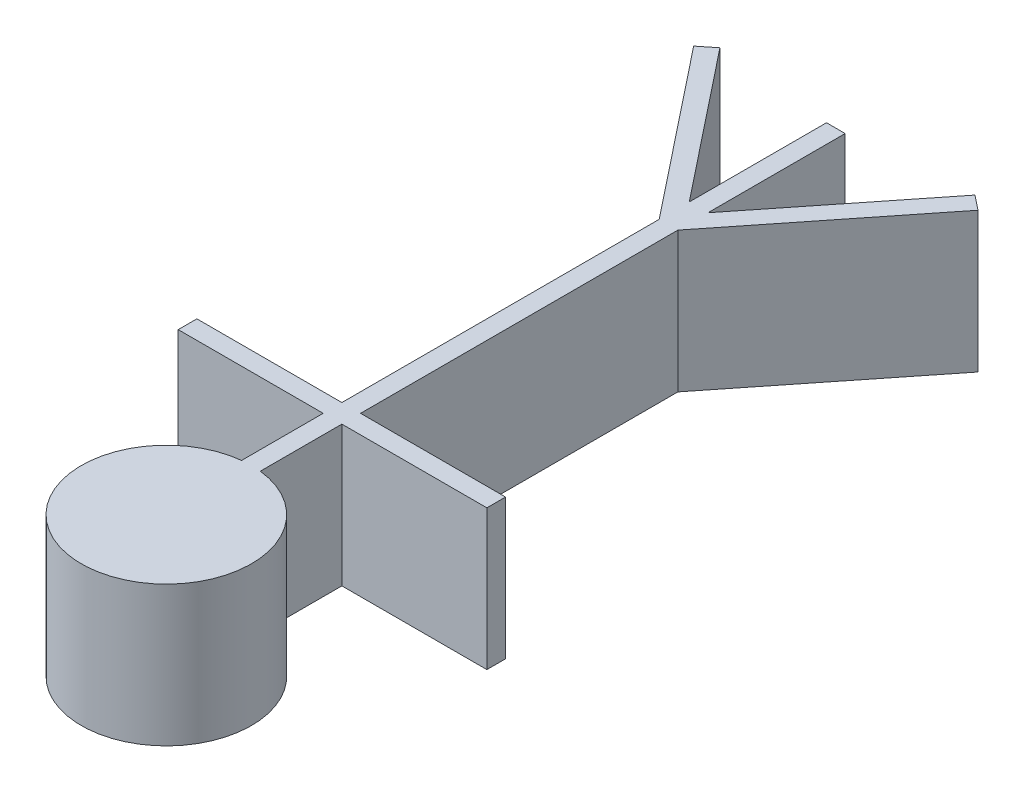
ISO-10303-21;
HEADER;
FILE_DESCRIPTION(('STEP AP214'),'2;1');
FILE_NAME('part.step','',(''),(''),'','','');
FILE_SCHEMA(('AUTOMOTIVE_DESIGN { 1 0 10303 214 1 1 1 1 }'));
ENDSEC;
DATA;
#1=APPLICATION_CONTEXT('core data for automotive mechanical design processes');
#2=APPLICATION_PROTOCOL_DEFINITION('international standard','automotive_design',2000,#1);
#3=PRODUCT_CONTEXT('',#1,'mechanical');
#4=PRODUCT('Part','Part','',(#3));
#5=PRODUCT_RELATED_PRODUCT_CATEGORY('part','',(#4));
#6=PRODUCT_DEFINITION_FORMATION('','',#4);
#7=PRODUCT_DEFINITION_CONTEXT('part definition',#1,'design');
#8=PRODUCT_DEFINITION('design','',#6,#7);
#9=PRODUCT_DEFINITION_SHAPE('','',#8);
#10=(LENGTH_UNIT() NAMED_UNIT(*) SI_UNIT(.MILLI.,.METRE.));
#11=(NAMED_UNIT(*) PLANE_ANGLE_UNIT() SI_UNIT($,.RADIAN.));
#12=(NAMED_UNIT(*) SI_UNIT($,.STERADIAN.) SOLID_ANGLE_UNIT());
#13=UNCERTAINTY_MEASURE_WITH_UNIT(LENGTH_MEASURE(1.E-05),#10,'distance_accuracy_value','');
#14=(GEOMETRIC_REPRESENTATION_CONTEXT(3) GLOBAL_UNCERTAINTY_ASSIGNED_CONTEXT((#13)) GLOBAL_UNIT_ASSIGNED_CONTEXT((#10,
#11,#12)) REPRESENTATION_CONTEXT('',''));
#15=CARTESIAN_POINT('',(0.,0.,0.));
#16=DIRECTION('',(0.,0.,1.));
#17=DIRECTION('',(1.,0.,0.));
#18=AXIS2_PLACEMENT_3D('',#15,#16,#17);
#19=CARTESIAN_POINT('',(-2.,30.,35.8119536050664));
#20=DIRECTION('',(1.,0.,0.));
#21=DIRECTION('',(0.,0.,-1.));
#22=AXIS2_PLACEMENT_3D('',#19,#20,#21);
#23=PLANE('',#22);
#24=DIRECTION('',(0.,0.,1.));
#25=VECTOR('',#24,1.);
#26=CARTESIAN_POINT('',(-2.,0.,35.8119536050664));
#27=LINE('',#26,#25);
#28=CARTESIAN_POINT('',(-2.,0.,35.8119536050664));
#29=VERTEX_POINT('',#28);
#30=CARTESIAN_POINT('',(-2.,0.,103.749471884295));
#31=VERTEX_POINT('',#30);
#32=EDGE_CURVE('E201',#29,#31,#27,.T.);
#33=ORIENTED_EDGE('',*,*,#32,.T.);
#34=DIRECTION('',(0.,-1.,0.));
#35=VECTOR('',#34,1.);
#36=CARTESIAN_POINT('',(-2.,30.,103.749471884295));
#37=LINE('',#36,#35);
#38=CARTESIAN_POINT('',(-2.,30.,103.749471884295));
#39=VERTEX_POINT('',#38);
#40=EDGE_CURVE('E11',#39,#31,#37,.T.);
#41=ORIENTED_EDGE('',*,*,#40,.F.);
#42=DIRECTION('',(0.,0.,1.));
#43=VECTOR('',#42,1.);
#44=CARTESIAN_POINT('',(-2.,30.,35.8119536050664));
#45=LINE('',#44,#43);
#46=CARTESIAN_POINT('',(-2.,30.,35.8119536050664));
#47=VERTEX_POINT('',#46);
#48=EDGE_CURVE('E239',#47,#39,#45,.T.);
#49=ORIENTED_EDGE('',*,*,#48,.F.);
#50=DIRECTION('',(0.,-1.,0.));
#51=VECTOR('',#50,1.);
#52=CARTESIAN_POINT('',(-2.,30.,35.8119536050664));
#53=LINE('',#52,#51);
#54=EDGE_CURVE('E197',#47,#29,#53,.T.);
#55=ORIENTED_EDGE('',*,*,#54,.T.);
#56=EDGE_LOOP('',(#33,#41,#49,#55));
#57=FACE_BOUND('',#56,.T.);
#58=ADVANCED_FACE('F33',(#57),#23,.F.);
#59=CARTESIAN_POINT('',(-33.0386105354812,30.,103.749471884295));
#60=DIRECTION('',(0.,0.,1.));
#61=DIRECTION('',(1.,0.,0.));
#62=AXIS2_PLACEMENT_3D('',#59,#60,#61);
#63=PLANE('',#62);
#64=DIRECTION('',(-1.,0.,0.));
#65=VECTOR('',#64,1.);
#66=CARTESIAN_POINT('',(-33.0386105354812,0.,103.749471884295));
#67=LINE('',#66,#65);
#68=CARTESIAN_POINT('',(-33.0386105354812,0.,103.749471884295));
#69=VERTEX_POINT('',#68);
#70=EDGE_CURVE('E204',#31,#69,#67,.T.);
#71=ORIENTED_EDGE('',*,*,#70,.T.);
#72=DIRECTION('',(0.,-1.,0.));
#73=VECTOR('',#72,1.);
#74=CARTESIAN_POINT('',(-33.0386105354812,30.,103.749471884295));
#75=LINE('',#74,#73);
#76=CARTESIAN_POINT('',(-33.0386105354812,30.,103.749471884295));
#77=VERTEX_POINT('',#76);
#78=EDGE_CURVE('E41',#77,#69,#75,.T.);
#79=ORIENTED_EDGE('',*,*,#78,.F.);
#80=DIRECTION('',(-1.,0.,0.));
#81=VECTOR('',#80,1.);
#82=CARTESIAN_POINT('',(-33.0386105354812,30.,103.749471884295));
#83=LINE('',#82,#81);
#84=EDGE_CURVE('E128',#39,#77,#83,.T.);
#85=ORIENTED_EDGE('',*,*,#84,.F.);
#86=ORIENTED_EDGE('',*,*,#40,.T.);
#87=EDGE_LOOP('',(#71,#79,#85,#86));
#88=FACE_BOUND('',#87,.T.);
#89=ADVANCED_FACE('F357',(#88),#63,.F.);
#90=CARTESIAN_POINT('',(-33.0386105354812,30.,107.749471884295));
#91=DIRECTION('',(1.,0.,0.));
#92=DIRECTION('',(0.,0.,-1.));
#93=AXIS2_PLACEMENT_3D('',#90,#91,#92);
#94=PLANE('',#93);
#95=DIRECTION('',(0.,0.,1.));
#96=VECTOR('',#95,1.);
#97=CARTESIAN_POINT('',(-33.0386105354812,0.,107.749471884295));
#98=LINE('',#97,#96);
#99=CARTESIAN_POINT('',(-33.0386105354812,0.,107.749471884295));
#100=VERTEX_POINT('',#99);
#101=EDGE_CURVE('E206',#69,#100,#98,.T.);
#102=ORIENTED_EDGE('',*,*,#101,.T.);
#103=DIRECTION('',(0.,-1.,0.));
#104=VECTOR('',#103,1.);
#105=CARTESIAN_POINT('',(-33.0386105354812,30.,107.749471884295));
#106=LINE('',#105,#104);
#107=CARTESIAN_POINT('',(-33.0386105354812,30.,107.749471884295));
#108=VERTEX_POINT('',#107);
#109=EDGE_CURVE('E282',#108,#100,#106,.T.);
#110=ORIENTED_EDGE('',*,*,#109,.F.);
#111=DIRECTION('',(0.,0.,1.));
#112=VECTOR('',#111,1.);
#113=CARTESIAN_POINT('',(-33.0386105354812,30.,107.749471884295));
#114=LINE('',#113,#112);
#115=EDGE_CURVE('E290',#77,#108,#114,.T.);
#116=ORIENTED_EDGE('',*,*,#115,.F.);
#117=ORIENTED_EDGE('',*,*,#78,.T.);
#118=EDGE_LOOP('',(#102,#110,#116,#117));
#119=FACE_BOUND('',#118,.T.);
#120=ADVANCED_FACE('F288',(#119),#94,.F.);
#121=CARTESIAN_POINT('',(-33.0386105354812,30.,107.749471884295));
#122=DIRECTION('',(0.,0.,-1.));
#123=DIRECTION('',(-1.,0.,0.));
#124=AXIS2_PLACEMENT_3D('',#121,#122,#123);
#125=PLANE('',#124);
#126=DIRECTION('',(1.,0.,0.));
#127=VECTOR('',#126,1.);
#128=CARTESIAN_POINT('',(-33.0386105354812,0.,107.749471884295));
#129=LINE('',#128,#127);
#130=CARTESIAN_POINT('',(-2.,0.,107.749471884295));
#131=VERTEX_POINT('',#130);
#132=EDGE_CURVE('E208',#100,#131,#129,.T.);
#133=ORIENTED_EDGE('',*,*,#132,.T.);
#134=DIRECTION('',(0.,-1.,0.));
#135=VECTOR('',#134,1.);
#136=CARTESIAN_POINT('',(-2.,30.,107.749471884295));
#137=LINE('',#136,#135);
#138=CARTESIAN_POINT('',(-2.,30.,107.749471884295));
#139=VERTEX_POINT('',#138);
#140=EDGE_CURVE('E279',#139,#131,#137,.T.);
#141=ORIENTED_EDGE('',*,*,#140,.F.);
#142=DIRECTION('',(1.,0.,0.));
#143=VECTOR('',#142,1.);
#144=CARTESIAN_POINT('',(-33.0386105354812,30.,107.749471884295));
#145=LINE('',#144,#143);
#146=EDGE_CURVE('E308',#108,#139,#145,.T.);
#147=ORIENTED_EDGE('',*,*,#146,.F.);
#148=ORIENTED_EDGE('',*,*,#109,.T.);
#149=EDGE_LOOP('',(#133,#141,#147,#148));
#150=FACE_BOUND('',#149,.T.);
#151=ADVANCED_FACE('F299',(#150),#125,.F.);
#152=CARTESIAN_POINT('',(-2.,30.,107.749471884295));
#153=DIRECTION('',(1.,0.,0.));
#154=DIRECTION('',(0.,0.,-1.));
#155=AXIS2_PLACEMENT_3D('',#152,#153,#154);
#156=PLANE('',#155);
#157=DIRECTION('',(0.,0.,1.));
#158=VECTOR('',#157,1.);
#159=CARTESIAN_POINT('',(-2.,0.,107.749471884295));
#160=LINE('',#159,#158);
#161=CARTESIAN_POINT('',(-2.,0.,125.214231970581));
#162=VERTEX_POINT('',#161);
#163=EDGE_CURVE('E210',#131,#162,#160,.T.);
#164=ORIENTED_EDGE('',*,*,#163,.T.);
#165=DIRECTION('',(0.,-1.,0.));
#166=VECTOR('',#165,1.);
#167=CARTESIAN_POINT('',(-2.,30.,125.214231970581));
#168=LINE('',#167,#166);
#169=CARTESIAN_POINT('',(-2.,30.,125.214231970581));
#170=VERTEX_POINT('',#169);
#171=EDGE_CURVE('E276',#170,#162,#168,.T.);
#172=ORIENTED_EDGE('',*,*,#171,.F.);
#173=DIRECTION('',(0.,0.,1.));
#174=VECTOR('',#173,1.);
#175=CARTESIAN_POINT('',(-2.,30.,107.749471884295));
#176=LINE('',#175,#174);
#177=EDGE_CURVE('E305',#139,#170,#176,.T.);
#178=ORIENTED_EDGE('',*,*,#177,.F.);
#179=ORIENTED_EDGE('',*,*,#140,.T.);
#180=EDGE_LOOP('',(#164,#172,#178,#179));
#181=FACE_BOUND('',#180,.T.);
#182=ADVANCED_FACE('F303',(#181),#156,.F.);
#183=CARTESIAN_POINT('',(0.,30.,143.326550630983));
#184=DIRECTION('',(0.,-1.,0.));
#185=DIRECTION('',(0.,0.,-1.));
#186=AXIS2_PLACEMENT_3D('',#183,#184,#185);
#187=CYLINDRICAL_SURFACE('',#186,18.2224061873281);
#188=CARTESIAN_POINT('',(0.,0.,143.326550630983));
#189=DIRECTION('',(0.,1.,0.));
#190=DIRECTION('',(0.,0.,1.));
#191=AXIS2_PLACEMENT_3D('',#188,#189,#190);
#192=CIRCLE('',#191,18.2224061873281);
#193=CARTESIAN_POINT('',(1.99999999999999,0.,125.214231970581));
#194=VERTEX_POINT('',#193);
#195=EDGE_CURVE('E212',#162,#194,#192,.T.);
#196=ORIENTED_EDGE('',*,*,#195,.T.);
#197=DIRECTION('',(0.,-1.,0.));
#198=VECTOR('',#197,1.);
#199=CARTESIAN_POINT('',(1.99999999999999,30.,125.214231970581));
#200=LINE('',#199,#198);
#201=CARTESIAN_POINT('',(1.99999999999999,30.,125.214231970581));
#202=VERTEX_POINT('',#201);
#203=EDGE_CURVE('E273',#202,#194,#200,.T.);
#204=ORIENTED_EDGE('',*,*,#203,.F.);
#205=CARTESIAN_POINT('',(0.,30.,143.326550630983));
#206=DIRECTION('',(0.,1.,0.));
#207=DIRECTION('',(0.,0.,1.));
#208=AXIS2_PLACEMENT_3D('',#205,#206,#207);
#209=CIRCLE('',#208,18.2224061873281);
#210=EDGE_CURVE('E307',#170,#202,#209,.T.);
#211=ORIENTED_EDGE('',*,*,#210,.F.);
#212=ORIENTED_EDGE('',*,*,#171,.T.);
#213=EDGE_LOOP('',(#196,#204,#211,#212));
#214=FACE_BOUND('',#213,.T.);
#215=ADVANCED_FACE('F370',(#214),#187,.T.);
#216=CARTESIAN_POINT('',(2.,30.,107.749471884295));
#217=DIRECTION('',(-1.,0.,0.));
#218=DIRECTION('',(0.,0.,1.));
#219=AXIS2_PLACEMENT_3D('',#216,#217,#218);
#220=PLANE('',#219);
#221=DIRECTION('',(0.,0.,-1.));
#222=VECTOR('',#221,1.);
#223=CARTESIAN_POINT('',(2.,0.,107.749471884295));
#224=LINE('',#223,#222);
#225=CARTESIAN_POINT('',(2.,0.,107.749471884295));
#226=VERTEX_POINT('',#225);
#227=EDGE_CURVE('E214',#194,#226,#224,.T.);
#228=ORIENTED_EDGE('',*,*,#227,.T.);
#229=DIRECTION('',(0.,-1.,0.));
#230=VECTOR('',#229,1.);
#231=CARTESIAN_POINT('',(2.,30.,107.749471884295));
#232=LINE('',#231,#230);
#233=CARTESIAN_POINT('',(2.,30.,107.749471884295));
#234=VERTEX_POINT('',#233);
#235=EDGE_CURVE('E270',#234,#226,#232,.T.);
#236=ORIENTED_EDGE('',*,*,#235,.F.);
#237=DIRECTION('',(0.,0.,-1.));
#238=VECTOR('',#237,1.);
#239=CARTESIAN_POINT('',(2.,30.,107.749471884295));
#240=LINE('',#239,#238);
#241=EDGE_CURVE('E310',#202,#234,#240,.T.);
#242=ORIENTED_EDGE('',*,*,#241,.F.);
#243=ORIENTED_EDGE('',*,*,#203,.T.);
#244=EDGE_LOOP('',(#228,#236,#242,#243));
#245=FACE_BOUND('',#244,.T.);
#246=ADVANCED_FACE('F373',(#245),#220,.F.);
#247=CARTESIAN_POINT('',(2.,30.,107.749471884295));
#248=DIRECTION('',(0.,0.,-1.));
#249=DIRECTION('',(-1.,0.,0.));
#250=AXIS2_PLACEMENT_3D('',#247,#248,#249);
#251=PLANE('',#250);
#252=DIRECTION('',(1.,0.,0.));
#253=VECTOR('',#252,1.);
#254=CARTESIAN_POINT('',(2.,0.,107.749471884295));
#255=LINE('',#254,#253);
#256=CARTESIAN_POINT('',(33.0386105354812,0.,107.749471884295));
#257=VERTEX_POINT('',#256);
#258=EDGE_CURVE('E216',#226,#257,#255,.T.);
#259=ORIENTED_EDGE('',*,*,#258,.T.);
#260=DIRECTION('',(0.,-1.,0.));
#261=VECTOR('',#260,1.);
#262=CARTESIAN_POINT('',(33.0386105354812,30.,107.749471884295));
#263=LINE('',#262,#261);
#264=CARTESIAN_POINT('',(33.0386105354812,30.,107.749471884295));
#265=VERTEX_POINT('',#264);
#266=EDGE_CURVE('E267',#265,#257,#263,.T.);
#267=ORIENTED_EDGE('',*,*,#266,.F.);
#268=DIRECTION('',(1.,0.,0.));
#269=VECTOR('',#268,1.);
#270=CARTESIAN_POINT('',(2.,30.,107.749471884295));
#271=LINE('',#270,#269);
#272=EDGE_CURVE('E316',#234,#265,#271,.T.);
#273=ORIENTED_EDGE('',*,*,#272,.F.);
#274=ORIENTED_EDGE('',*,*,#235,.T.);
#275=EDGE_LOOP('',(#259,#267,#273,#274));
#276=FACE_BOUND('',#275,.T.);
#277=ADVANCED_FACE('F377',(#276),#251,.F.);
#278=CARTESIAN_POINT('',(33.0386105354812,30.,107.749471884295));
#279=DIRECTION('',(-1.,0.,0.));
#280=DIRECTION('',(0.,0.,1.));
#281=AXIS2_PLACEMENT_3D('',#278,#279,#280);
#282=PLANE('',#281);
#283=DIRECTION('',(0.,0.,-1.));
#284=VECTOR('',#283,1.);
#285=CARTESIAN_POINT('',(33.0386105354812,0.,107.749471884295));
#286=LINE('',#285,#284);
#287=CARTESIAN_POINT('',(33.0386105354812,0.,103.749471884295));
#288=VERTEX_POINT('',#287);
#289=EDGE_CURVE('E218',#257,#288,#286,.T.);
#290=ORIENTED_EDGE('',*,*,#289,.T.);
#291=DIRECTION('',(0.,-1.,0.));
#292=VECTOR('',#291,1.);
#293=CARTESIAN_POINT('',(33.0386105354812,30.,103.749471884295));
#294=LINE('',#293,#292);
#295=CARTESIAN_POINT('',(33.0386105354812,30.,103.749471884295));
#296=VERTEX_POINT('',#295);
#297=EDGE_CURVE('E264',#296,#288,#294,.T.);
#298=ORIENTED_EDGE('',*,*,#297,.F.);
#299=DIRECTION('',(0.,0.,-1.));
#300=VECTOR('',#299,1.);
#301=CARTESIAN_POINT('',(33.0386105354812,30.,107.749471884295));
#302=LINE('',#301,#300);
#303=EDGE_CURVE('E318',#265,#296,#302,.T.);
#304=ORIENTED_EDGE('',*,*,#303,.F.);
#305=ORIENTED_EDGE('',*,*,#266,.T.);
#306=EDGE_LOOP('',(#290,#298,#304,#305));
#307=FACE_BOUND('',#306,.T.);
#308=ADVANCED_FACE('F381',(#307),#282,.F.);
#309=CARTESIAN_POINT('',(2.,30.,103.749471884295));
#310=DIRECTION('',(0.,0.,1.));
#311=DIRECTION('',(1.,0.,0.));
#312=AXIS2_PLACEMENT_3D('',#309,#310,#311);
#313=PLANE('',#312);
#314=DIRECTION('',(-1.,0.,0.));
#315=VECTOR('',#314,1.);
#316=CARTESIAN_POINT('',(2.,0.,103.749471884295));
#317=LINE('',#316,#315);
#318=CARTESIAN_POINT('',(2.,0.,103.749471884295));
#319=VERTEX_POINT('',#318);
#320=EDGE_CURVE('E220',#288,#319,#317,.T.);
#321=ORIENTED_EDGE('',*,*,#320,.T.);
#322=DIRECTION('',(0.,-1.,0.));
#323=VECTOR('',#322,1.);
#324=CARTESIAN_POINT('',(2.,30.,103.749471884295));
#325=LINE('',#324,#323);
#326=CARTESIAN_POINT('',(2.,30.,103.749471884295));
#327=VERTEX_POINT('',#326);
#328=EDGE_CURVE('E261',#327,#319,#325,.T.);
#329=ORIENTED_EDGE('',*,*,#328,.F.);
#330=DIRECTION('',(-1.,0.,0.));
#331=VECTOR('',#330,1.);
#332=CARTESIAN_POINT('',(2.,30.,103.749471884295));
#333=LINE('',#332,#331);
#334=EDGE_CURVE('E320',#296,#327,#333,.T.);
#335=ORIENTED_EDGE('',*,*,#334,.F.);
#336=ORIENTED_EDGE('',*,*,#297,.T.);
#337=EDGE_LOOP('',(#321,#329,#335,#336));
#338=FACE_BOUND('',#337,.T.);
#339=ADVANCED_FACE('F385',(#338),#313,.F.);
#340=CARTESIAN_POINT('',(2.,30.,35.8119536050664));
#341=DIRECTION('',(-1.,0.,0.));
#342=DIRECTION('',(0.,0.,1.));
#343=AXIS2_PLACEMENT_3D('',#340,#341,#342);
#344=PLANE('',#343);
#345=DIRECTION('',(0.,0.,-1.));
#346=VECTOR('',#345,1.);
#347=CARTESIAN_POINT('',(2.,0.,35.8119536050664));
#348=LINE('',#347,#346);
#349=CARTESIAN_POINT('',(2.,0.,35.8119536050664));
#350=VERTEX_POINT('',#349);
#351=EDGE_CURVE('E222',#319,#350,#348,.T.);
#352=ORIENTED_EDGE('',*,*,#351,.T.);
#353=DIRECTION('',(0.,-1.,0.));
#354=VECTOR('',#353,1.);
#355=CARTESIAN_POINT('',(2.,30.,35.8119536050664));
#356=LINE('',#355,#354);
#357=CARTESIAN_POINT('',(2.,30.,35.8119536050664));
#358=VERTEX_POINT('',#357);
#359=EDGE_CURVE('E258',#358,#350,#356,.T.);
#360=ORIENTED_EDGE('',*,*,#359,.F.);
#361=DIRECTION('',(0.,0.,-1.));
#362=VECTOR('',#361,1.);
#363=CARTESIAN_POINT('',(2.,30.,35.8119536050664));
#364=LINE('',#363,#362);
#365=EDGE_CURVE('E322',#327,#358,#364,.T.);
#366=ORIENTED_EDGE('',*,*,#365,.F.);
#367=ORIENTED_EDGE('',*,*,#328,.T.);
#368=EDGE_LOOP('',(#352,#360,#366,#367));
#369=FACE_BOUND('',#368,.T.);
#370=ADVANCED_FACE('F389',(#369),#344,.F.);
#371=CARTESIAN_POINT('',(2.,30.,35.8119536050664));
#372=DIRECTION('',(-0.783148064250629,0.,-0.621835275181855));
#373=DIRECTION('',(-0.621835275181855,0.,0.783148064250629));
#374=AXIS2_PLACEMENT_3D('',#371,#372,#373);
#375=PLANE('',#374);
#376=DIRECTION('',(0.621835275181855,0.,-0.783148064250629));
#377=VECTOR('',#376,1.);
#378=CARTESIAN_POINT('',(2.,0.,35.8119536050664));
#379=LINE('',#378,#377);
#380=CARTESIAN_POINT('',(30.4354096515771,0.,0.));
#381=VERTEX_POINT('',#380);
#382=EDGE_CURVE('E224',#350,#381,#379,.T.);
#383=ORIENTED_EDGE('',*,*,#382,.T.);
#384=DIRECTION('',(0.,-1.,0.));
#385=VECTOR('',#384,1.);
#386=CARTESIAN_POINT('',(30.4354096515771,30.,0.));
#387=LINE('',#386,#385);
#388=CARTESIAN_POINT('',(30.4354096515771,30.,0.));
#389=VERTEX_POINT('',#388);
#390=EDGE_CURVE('E255',#389,#381,#387,.T.);
#391=ORIENTED_EDGE('',*,*,#390,.F.);
#392=DIRECTION('',(0.621835275181855,0.,-0.783148064250629));
#393=VECTOR('',#392,1.);
#394=CARTESIAN_POINT('',(2.,30.,35.8119536050664));
#395=LINE('',#394,#393);
#396=EDGE_CURVE('E324',#358,#389,#395,.T.);
#397=ORIENTED_EDGE('',*,*,#396,.F.);
#398=ORIENTED_EDGE('',*,*,#359,.T.);
#399=EDGE_LOOP('',(#383,#391,#397,#398));
#400=FACE_BOUND('',#399,.T.);
#401=ADVANCED_FACE('F393',(#400),#375,.F.);
#402=CARTESIAN_POINT('',(27.3028173945746,30.,-2.48734110072743));
#403=DIRECTION('',(-0.621835275181856,0.,0.783148064250628));
#404=DIRECTION('',(0.783148064250628,0.,0.621835275181856));
#405=AXIS2_PLACEMENT_3D('',#402,#403,#404);
#406=PLANE('',#405);
#407=DIRECTION('',(-0.783148064250628,0.,-0.621835275181856));
#408=VECTOR('',#407,1.);
#409=CARTESIAN_POINT('',(27.3028173945746,0.,-2.48734110072743));
#410=LINE('',#409,#408);
#411=CARTESIAN_POINT('',(27.3028173945746,0.,-2.48734110072743));
#412=VERTEX_POINT('',#411);
#413=EDGE_CURVE('E226',#381,#412,#410,.T.);
#414=ORIENTED_EDGE('',*,*,#413,.T.);
#415=DIRECTION('',(0.,-1.,0.));
#416=VECTOR('',#415,1.);
#417=CARTESIAN_POINT('',(27.3028173945746,30.,-2.48734110072743));
#418=LINE('',#417,#416);
#419=CARTESIAN_POINT('',(27.3028173945746,30.,-2.48734110072743));
#420=VERTEX_POINT('',#419);
#421=EDGE_CURVE('E252',#420,#412,#418,.T.);
#422=ORIENTED_EDGE('',*,*,#421,.F.);
#423=DIRECTION('',(-0.783148064250628,0.,-0.621835275181856));
#424=VECTOR('',#423,1.);
#425=CARTESIAN_POINT('',(27.3028173945746,30.,-2.48734110072743));
#426=LINE('',#425,#424);
#427=EDGE_CURVE('E326',#389,#420,#426,.T.);
#428=ORIENTED_EDGE('',*,*,#427,.F.);
#429=ORIENTED_EDGE('',*,*,#390,.T.);
#430=EDGE_LOOP('',(#414,#422,#428,#429));
#431=FACE_BOUND('',#430,.T.);
#432=ADVANCED_FACE('F397',(#431),#406,.F.);
#433=CARTESIAN_POINT('',(2.,30.,29.3793818941254));
#434=DIRECTION('',(0.783148064250629,0.,0.621835275181855));
#435=DIRECTION('',(0.621835275181855,0.,-0.783148064250629));
#436=AXIS2_PLACEMENT_3D('',#433,#434,#435);
#437=PLANE('',#436);
#438=DIRECTION('',(-0.621835275181855,0.,0.783148064250629));
#439=VECTOR('',#438,1.);
#440=CARTESIAN_POINT('',(2.,0.,29.3793818941254));
#441=LINE('',#440,#439);
#442=CARTESIAN_POINT('',(2.,0.,29.3793818941254));
#443=VERTEX_POINT('',#442);
#444=EDGE_CURVE('E228',#412,#443,#441,.T.);
#445=ORIENTED_EDGE('',*,*,#444,.T.);
#446=DIRECTION('',(0.,-1.,0.));
#447=VECTOR('',#446,1.);
#448=CARTESIAN_POINT('',(2.,30.,29.3793818941254));
#449=LINE('',#448,#447);
#450=CARTESIAN_POINT('',(2.,30.,29.3793818941254));
#451=VERTEX_POINT('',#450);
#452=EDGE_CURVE('E249',#451,#443,#449,.T.);
#453=ORIENTED_EDGE('',*,*,#452,.F.);
#454=DIRECTION('',(-0.621835275181855,0.,0.783148064250629));
#455=VECTOR('',#454,1.);
#456=CARTESIAN_POINT('',(2.,30.,29.3793818941254));
#457=LINE('',#456,#455);
#458=EDGE_CURVE('E328',#420,#451,#457,.T.);
#459=ORIENTED_EDGE('',*,*,#458,.F.);
#460=ORIENTED_EDGE('',*,*,#421,.T.);
#461=EDGE_LOOP('',(#445,#453,#459,#460));
#462=FACE_BOUND('',#461,.T.);
#463=ADVANCED_FACE('F401',(#462),#437,.F.);
#464=CARTESIAN_POINT('',(2.,30.,0.));
#465=DIRECTION('',(-1.,0.,0.));
#466=DIRECTION('',(0.,0.,1.));
#467=AXIS2_PLACEMENT_3D('',#464,#465,#466);
#468=PLANE('',#467);
#469=DIRECTION('',(0.,0.,-1.));
#470=VECTOR('',#469,1.);
#471=CARTESIAN_POINT('',(2.,0.,0.));
#472=LINE('',#471,#470);
#473=CARTESIAN_POINT('',(2.,0.,0.));
#474=VERTEX_POINT('',#473);
#475=EDGE_CURVE('E230',#443,#474,#472,.T.);
#476=ORIENTED_EDGE('',*,*,#475,.T.);
#477=DIRECTION('',(0.,-1.,0.));
#478=VECTOR('',#477,1.);
#479=CARTESIAN_POINT('',(2.,30.,0.));
#480=LINE('',#479,#478);
#481=CARTESIAN_POINT('',(2.,30.,0.));
#482=VERTEX_POINT('',#481);
#483=EDGE_CURVE('E246',#482,#474,#480,.T.);
#484=ORIENTED_EDGE('',*,*,#483,.F.);
#485=DIRECTION('',(0.,0.,-1.));
#486=VECTOR('',#485,1.);
#487=CARTESIAN_POINT('',(2.,30.,0.));
#488=LINE('',#487,#486);
#489=EDGE_CURVE('E330',#451,#482,#488,.T.);
#490=ORIENTED_EDGE('',*,*,#489,.F.);
#491=ORIENTED_EDGE('',*,*,#452,.T.);
#492=EDGE_LOOP('',(#476,#484,#490,#491));
#493=FACE_BOUND('',#492,.T.);
#494=ADVANCED_FACE('F405',(#493),#468,.F.);
#495=CARTESIAN_POINT('',(-2.,30.,0.));
#496=DIRECTION('',(0.,0.,1.));
#497=DIRECTION('',(1.,0.,0.));
#498=AXIS2_PLACEMENT_3D('',#495,#496,#497);
#499=PLANE('',#498);
#500=DIRECTION('',(-1.,0.,0.));
#501=VECTOR('',#500,1.);
#502=CARTESIAN_POINT('',(-2.,0.,0.));
#503=LINE('',#502,#501);
#504=CARTESIAN_POINT('',(-2.,0.,0.));
#505=VERTEX_POINT('',#504);
#506=EDGE_CURVE('E232',#474,#505,#503,.T.);
#507=ORIENTED_EDGE('',*,*,#506,.T.);
#508=DIRECTION('',(0.,-1.,0.));
#509=VECTOR('',#508,1.);
#510=CARTESIAN_POINT('',(-2.,30.,0.));
#511=LINE('',#510,#509);
#512=CARTESIAN_POINT('',(-2.,30.,0.));
#513=VERTEX_POINT('',#512);
#514=EDGE_CURVE('E243',#513,#505,#511,.T.);
#515=ORIENTED_EDGE('',*,*,#514,.F.);
#516=DIRECTION('',(-1.,0.,0.));
#517=VECTOR('',#516,1.);
#518=CARTESIAN_POINT('',(-2.,30.,0.));
#519=LINE('',#518,#517);
#520=EDGE_CURVE('E332',#482,#513,#519,.T.);
#521=ORIENTED_EDGE('',*,*,#520,.F.);
#522=ORIENTED_EDGE('',*,*,#483,.T.);
#523=EDGE_LOOP('',(#507,#515,#521,#522));
#524=FACE_BOUND('',#523,.T.);
#525=ADVANCED_FACE('F338',(#524),#499,.F.);
#526=CARTESIAN_POINT('',(-2.,30.,0.));
#527=DIRECTION('',(1.,0.,0.));
#528=DIRECTION('',(0.,0.,-1.));
#529=AXIS2_PLACEMENT_3D('',#526,#527,#528);
#530=PLANE('',#529);
#531=DIRECTION('',(0.,0.,1.));
#532=VECTOR('',#531,1.);
#533=CARTESIAN_POINT('',(-2.,0.,0.));
#534=LINE('',#533,#532);
#535=CARTESIAN_POINT('',(-2.,0.,29.3793818941254));
#536=VERTEX_POINT('',#535);
#537=EDGE_CURVE('E234',#505,#536,#534,.T.);
#538=ORIENTED_EDGE('',*,*,#537,.T.);
#539=DIRECTION('',(0.,-1.,0.));
#540=VECTOR('',#539,1.);
#541=CARTESIAN_POINT('',(-2.,30.,29.3793818941254));
#542=LINE('',#541,#540);
#543=CARTESIAN_POINT('',(-2.,30.,29.3793818941254));
#544=VERTEX_POINT('',#543);
#545=EDGE_CURVE('E192',#544,#536,#542,.T.);
#546=ORIENTED_EDGE('',*,*,#545,.F.);
#547=DIRECTION('',(0.,0.,1.));
#548=VECTOR('',#547,1.);
#549=CARTESIAN_POINT('',(-2.,30.,0.));
#550=LINE('',#549,#548);
#551=EDGE_CURVE('E183',#513,#544,#550,.T.);
#552=ORIENTED_EDGE('',*,*,#551,.F.);
#553=ORIENTED_EDGE('',*,*,#514,.T.);
#554=EDGE_LOOP('',(#538,#546,#552,#553));
#555=FACE_BOUND('',#554,.T.);
#556=ADVANCED_FACE('F342',(#555),#530,.F.);
#557=CARTESIAN_POINT('',(-2.,30.,29.3793818941254));
#558=DIRECTION('',(-0.783148064250629,0.,0.621835275181855));
#559=DIRECTION('',(0.621835275181855,0.,0.783148064250629));
#560=AXIS2_PLACEMENT_3D('',#557,#558,#559);
#561=PLANE('',#560);
#562=DIRECTION('',(-0.621835275181855,0.,-0.783148064250629));
#563=VECTOR('',#562,1.);
#564=CARTESIAN_POINT('',(-2.,0.,29.3793818941254));
#565=LINE('',#564,#563);
#566=CARTESIAN_POINT('',(-27.3028173945746,0.,-2.48734110072743));
#567=VERTEX_POINT('',#566);
#568=EDGE_CURVE('E191',#536,#567,#565,.T.);
#569=ORIENTED_EDGE('',*,*,#568,.T.);
#570=DIRECTION('',(0.,-1.,0.));
#571=VECTOR('',#570,1.);
#572=CARTESIAN_POINT('',(-27.3028173945746,30.,-2.48734110072743));
#573=LINE('',#572,#571);
#574=CARTESIAN_POINT('',(-27.3028173945746,30.,-2.48734110072743));
#575=VERTEX_POINT('',#574);
#576=EDGE_CURVE('E188',#575,#567,#573,.T.);
#577=ORIENTED_EDGE('',*,*,#576,.F.);
#578=DIRECTION('',(-0.621835275181855,0.,-0.783148064250629));
#579=VECTOR('',#578,1.);
#580=CARTESIAN_POINT('',(-2.,30.,29.3793818941254));
#581=LINE('',#580,#579);
#582=EDGE_CURVE('E177',#544,#575,#581,.T.);
#583=ORIENTED_EDGE('',*,*,#582,.F.);
#584=ORIENTED_EDGE('',*,*,#545,.T.);
#585=EDGE_LOOP('',(#569,#577,#583,#584));
#586=FACE_BOUND('',#585,.T.);
#587=ADVANCED_FACE('F189',(#586),#561,.F.);
#588=CARTESIAN_POINT('',(-30.4354096515771,30.,0.));
#589=DIRECTION('',(0.621835275181856,0.,0.783148064250628));
#590=DIRECTION('',(0.783148064250628,0.,-0.621835275181856));
#591=AXIS2_PLACEMENT_3D('',#588,#589,#590);
#592=PLANE('',#591);
#593=DIRECTION('',(-0.783148064250628,0.,0.621835275181856));
#594=VECTOR('',#593,1.);
#595=CARTESIAN_POINT('',(-30.4354096515771,0.,0.));
#596=LINE('',#595,#594);
#597=CARTESIAN_POINT('',(-30.4354096515771,0.,0.));
#598=VERTEX_POINT('',#597);
#599=EDGE_CURVE('E114',#567,#598,#596,.T.);
#600=ORIENTED_EDGE('',*,*,#599,.T.);
#601=DIRECTION('',(0.,-1.,0.));
#602=VECTOR('',#601,1.);
#603=CARTESIAN_POINT('',(-30.4354096515771,30.,0.));
#604=LINE('',#603,#602);
#605=CARTESIAN_POINT('',(-30.4354096515771,30.,0.));
#606=VERTEX_POINT('',#605);
#607=EDGE_CURVE('E193',#606,#598,#604,.T.);
#608=ORIENTED_EDGE('',*,*,#607,.F.);
#609=DIRECTION('',(-0.783148064250628,0.,0.621835275181856));
#610=VECTOR('',#609,1.);
#611=CARTESIAN_POINT('',(-30.4354096515771,30.,0.));
#612=LINE('',#611,#610);
#613=EDGE_CURVE('E181',#575,#606,#612,.T.);
#614=ORIENTED_EDGE('',*,*,#613,.F.);
#615=ORIENTED_EDGE('',*,*,#576,.T.);
#616=EDGE_LOOP('',(#600,#608,#614,#615));
#617=FACE_BOUND('',#616,.T.);
#618=ADVANCED_FACE('F195',(#617),#592,.F.);
#619=CARTESIAN_POINT('',(-2.,30.,35.8119536050664));
#620=DIRECTION('',(0.783148064250629,0.,-0.621835275181855));
#621=DIRECTION('',(-0.621835275181855,0.,-0.783148064250629));
#622=AXIS2_PLACEMENT_3D('',#619,#620,#621);
#623=PLANE('',#622);
#624=DIRECTION('',(0.621835275181855,0.,0.783148064250629));
#625=VECTOR('',#624,1.);
#626=CARTESIAN_POINT('',(-2.,0.,35.8119536050664));
#627=LINE('',#626,#625);
#628=EDGE_CURVE('E120',#598,#29,#627,.T.);
#629=ORIENTED_EDGE('',*,*,#628,.T.);
#630=ORIENTED_EDGE('',*,*,#54,.F.);
#631=DIRECTION('',(0.621835275181855,0.,0.783148064250629));
#632=VECTOR('',#631,1.);
#633=CARTESIAN_POINT('',(-2.,30.,35.8119536050664));
#634=LINE('',#633,#632);
#635=EDGE_CURVE('E49',#606,#47,#634,.T.);
#636=ORIENTED_EDGE('',*,*,#635,.F.);
#637=ORIENTED_EDGE('',*,*,#607,.T.);
#638=EDGE_LOOP('',(#629,#630,#636,#637));
#639=FACE_BOUND('',#638,.T.);
#640=ADVANCED_FACE('F346',(#639),#623,.F.);
#641=CARTESIAN_POINT('',(0.,30.,143.326550630983));
#642=DIRECTION('',(0.,1.,0.));
#643=DIRECTION('',(0.,0.,1.));
#644=AXIS2_PLACEMENT_3D('',#641,#642,#643);
#645=PLANE('',#644);
#646=ORIENTED_EDGE('',*,*,#48,.T.);
#647=ORIENTED_EDGE('',*,*,#84,.T.);
#648=ORIENTED_EDGE('',*,*,#115,.T.);
#649=ORIENTED_EDGE('',*,*,#146,.T.);
#650=ORIENTED_EDGE('',*,*,#177,.T.);
#651=ORIENTED_EDGE('',*,*,#210,.T.);
#652=ORIENTED_EDGE('',*,*,#241,.T.);
#653=ORIENTED_EDGE('',*,*,#272,.T.);
#654=ORIENTED_EDGE('',*,*,#303,.T.);
#655=ORIENTED_EDGE('',*,*,#334,.T.);
#656=ORIENTED_EDGE('',*,*,#365,.T.);
#657=ORIENTED_EDGE('',*,*,#396,.T.);
#658=ORIENTED_EDGE('',*,*,#427,.T.);
#659=ORIENTED_EDGE('',*,*,#458,.T.);
#660=ORIENTED_EDGE('',*,*,#489,.T.);
#661=ORIENTED_EDGE('',*,*,#520,.T.);
#662=ORIENTED_EDGE('',*,*,#551,.T.);
#663=ORIENTED_EDGE('',*,*,#582,.T.);
#664=ORIENTED_EDGE('',*,*,#613,.T.);
#665=ORIENTED_EDGE('',*,*,#635,.T.);
#666=EDGE_LOOP('',(#646,#647,#648,#649,#650,#651,#652,#653,#654,#655,#656,#657,#658,#659,#660,
#661,#662,#663,#664,#665));
#667=FACE_BOUND('',#666,.T.);
#668=ADVANCED_FACE('F179',(#667),#645,.T.);
#669=CARTESIAN_POINT('',(0.,0.,143.326550630983));
#670=DIRECTION('',(0.,1.,0.));
#671=DIRECTION('',(0.,0.,1.));
#672=AXIS2_PLACEMENT_3D('',#669,#670,#671);
#673=PLANE('',#672);
#674=ORIENTED_EDGE('',*,*,#32,.F.);
#675=ORIENTED_EDGE('',*,*,#628,.F.);
#676=ORIENTED_EDGE('',*,*,#599,.F.);
#677=ORIENTED_EDGE('',*,*,#568,.F.);
#678=ORIENTED_EDGE('',*,*,#537,.F.);
#679=ORIENTED_EDGE('',*,*,#506,.F.);
#680=ORIENTED_EDGE('',*,*,#475,.F.);
#681=ORIENTED_EDGE('',*,*,#444,.F.);
#682=ORIENTED_EDGE('',*,*,#413,.F.);
#683=ORIENTED_EDGE('',*,*,#382,.F.);
#684=ORIENTED_EDGE('',*,*,#351,.F.);
#685=ORIENTED_EDGE('',*,*,#320,.F.);
#686=ORIENTED_EDGE('',*,*,#289,.F.);
#687=ORIENTED_EDGE('',*,*,#258,.F.);
#688=ORIENTED_EDGE('',*,*,#227,.F.);
#689=ORIENTED_EDGE('',*,*,#195,.F.);
#690=ORIENTED_EDGE('',*,*,#163,.F.);
#691=ORIENTED_EDGE('',*,*,#132,.F.);
#692=ORIENTED_EDGE('',*,*,#101,.F.);
#693=ORIENTED_EDGE('',*,*,#70,.F.);
#694=EDGE_LOOP('',(#674,#675,#676,#677,#678,#679,#680,#681,#682,#683,#684,#685,#686,#687,#688,
#689,#690,#691,#692,#693));
#695=FACE_BOUND('',#694,.T.);
#696=ADVANCED_FACE('F294',(#695),#673,.F.);
#697=CLOSED_SHELL('',(#58,#89,#120,#151,#182,#215,#246,#277,#308,#339,#370,#401,#432,#463,#494,
#525,#556,#587,#618,#640,#668,#696));
#698=MANIFOLD_SOLID_BREP('B2',#697);
#699=ADVANCED_BREP_SHAPE_REPRESENTATION('',(#18,#698),#14);
#700=SHAPE_DEFINITION_REPRESENTATION(#9,#699);
ENDSEC;
END-ISO-10303-21;
